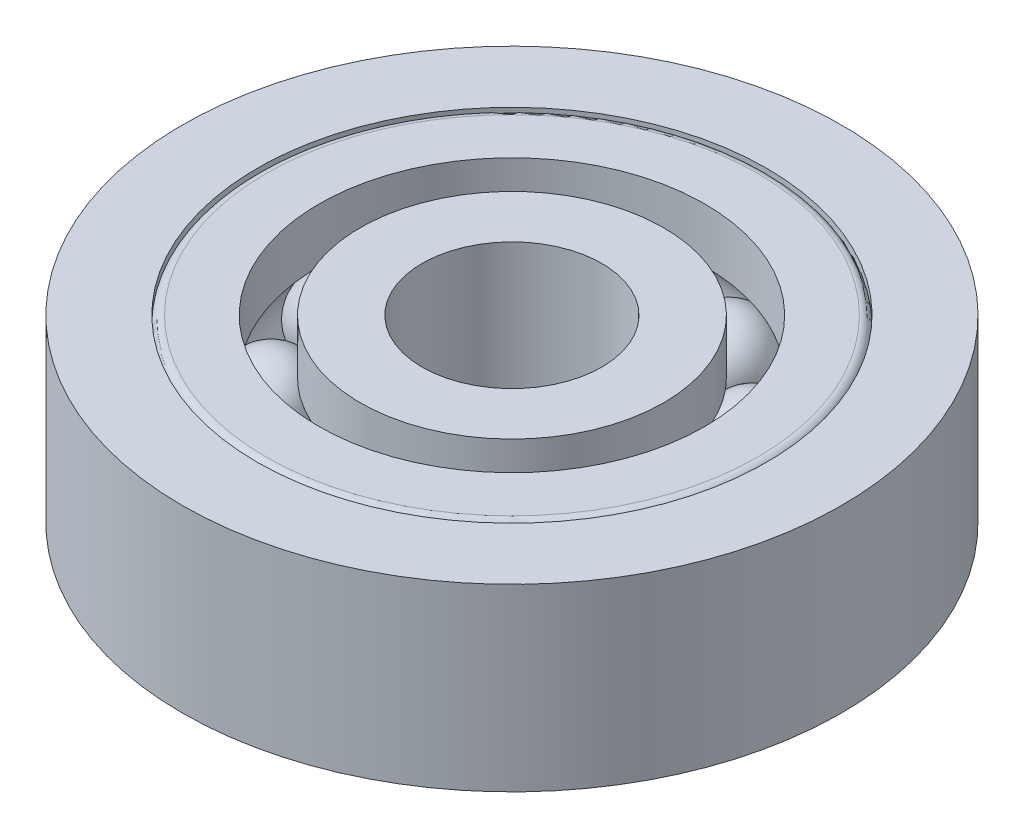
ISO-10303-21;
HEADER;
FILE_DESCRIPTION(('STEP AP214'),'2;1');
FILE_NAME('part.step','',(''),(''),'','','');
FILE_SCHEMA(('AUTOMOTIVE_DESIGN { 1 0 10303 214 1 1 1 1 }'));
ENDSEC;
DATA;
#1=APPLICATION_CONTEXT('core data for automotive mechanical design processes');
#2=APPLICATION_PROTOCOL_DEFINITION('international standard','automotive_design',2000,#1);
#3=PRODUCT_CONTEXT('',#1,'mechanical');
#4=PRODUCT('Part','Part','',(#3));
#5=PRODUCT_RELATED_PRODUCT_CATEGORY('part','',(#4));
#6=PRODUCT_DEFINITION_FORMATION('','',#4);
#7=PRODUCT_DEFINITION_CONTEXT('part definition',#1,'design');
#8=PRODUCT_DEFINITION('design','',#6,#7);
#9=PRODUCT_DEFINITION_SHAPE('','',#8);
#10=(LENGTH_UNIT() NAMED_UNIT(*) SI_UNIT(.MILLI.,.METRE.));
#11=(NAMED_UNIT(*) PLANE_ANGLE_UNIT() SI_UNIT($,.RADIAN.));
#12=(NAMED_UNIT(*) SI_UNIT($,.STERADIAN.) SOLID_ANGLE_UNIT());
#13=UNCERTAINTY_MEASURE_WITH_UNIT(LENGTH_MEASURE(1.E-05),#10,'distance_accuracy_value','');
#14=(GEOMETRIC_REPRESENTATION_CONTEXT(3) GLOBAL_UNCERTAINTY_ASSIGNED_CONTEXT((#13)) GLOBAL_UNIT_ASSIGNED_CONTEXT((#10,
#11,#12)) REPRESENTATION_CONTEXT('',''));
#15=CARTESIAN_POINT('',(0.,0.,0.));
#16=DIRECTION('',(0.,0.,1.));
#17=DIRECTION('',(1.,0.,0.));
#18=AXIS2_PLACEMENT_3D('',#15,#16,#17);
#19=CARTESIAN_POINT('',(-13.9057656321242,5.04553595945562,13.088073298508));
#20=DIRECTION('',(0.,-1.,0.));
#21=DIRECTION('',(-0.809016994374955,0.,0.587785252292462));
#22=AXIS2_PLACEMENT_3D('',#19,#20,#21);
#23=SPHERICAL_SURFACE('',#22,1.37500000000002);
#24=CARTESIAN_POINT('',(-13.9057656321242,3.6705359594556,13.088073298508));
#25=VERTEX_POINT('',#24);
#26=VERTEX_LOOP('',#25);
#27=FACE_BOUND('',#26,.T.);
#28=ADVANCED_FACE('F40',(#27),#23,.T.);
#29=CLOSED_SHELL('',(#28));
#30=MANIFOLD_SOLID_BREP('B2',#29);
#31=CARTESIAN_POINT('',(-11.0307656321242,5.04553595945562,15.1768830665235));
#32=DIRECTION('',(0.,-1.,0.));
#33=DIRECTION('',(-0.309016994374958,0.,0.95105651629515));
#34=AXIS2_PLACEMENT_3D('',#31,#32,#33);
#35=SPHERICAL_SURFACE('',#34,1.37500000000002);
#36=CARTESIAN_POINT('',(-11.0307656321242,3.6705359594556,15.1768830665235));
#37=VERTEX_POINT('',#36);
#38=VERTEX_LOOP('',#37);
#39=FACE_BOUND('',#38,.T.);
#40=ADVANCED_FACE('F59',(#39),#35,.T.);
#41=CLOSED_SHELL('',(#40));
#42=MANIFOLD_SOLID_BREP('B6',#41);
#43=CARTESIAN_POINT('',(-7.47707019681233,5.04553595945562,15.1768830665235));
#44=DIRECTION('',(0.,-1.,0.));
#45=DIRECTION('',(0.309016994374938,0.,0.951056516295157));
#46=AXIS2_PLACEMENT_3D('',#43,#44,#45);
#47=SPHERICAL_SURFACE('',#46,1.37500000000002);
#48=CARTESIAN_POINT('',(-7.47707019681233,3.6705359594556,15.1768830665235));
#49=VERTEX_POINT('',#48);
#50=VERTEX_LOOP('',#49);
#51=FACE_BOUND('',#50,.T.);
#52=ADVANCED_FACE('F78',(#51),#47,.T.);
#53=CLOSED_SHELL('',(#52));
#54=MANIFOLD_SOLID_BREP('B36',#53);
#55=CARTESIAN_POINT('',(-4.6020701968123,5.04553595945562,13.0880732985081));
#56=DIRECTION('',(0.,-1.,0.));
#57=DIRECTION('',(0.809016994374942,0.,0.58778525229248));
#58=AXIS2_PLACEMENT_3D('',#55,#56,#57);
#59=SPHERICAL_SURFACE('',#58,1.37500000000002);
#60=CARTESIAN_POINT('',(-4.6020701968123,3.6705359594556,13.0880732985081));
#61=VERTEX_POINT('',#60);
#62=VERTEX_LOOP('',#61);
#63=FACE_BOUND('',#62,.T.);
#64=ADVANCED_FACE('F97',(#63),#59,.T.);
#65=CLOSED_SHELL('',(#64));
#66=MANIFOLD_SOLID_BREP('B55',#65);
#67=CARTESIAN_POINT('',(-3.50391791446822,5.04553595945562,9.70830809782638));
#68=DIRECTION('',(0.,-1.,0.));
#69=DIRECTION('',(1.,0.,0.));
#70=AXIS2_PLACEMENT_3D('',#67,#68,#69);
#71=SPHERICAL_SURFACE('',#70,1.37500000000002);
#72=CARTESIAN_POINT('',(-3.50391791446822,3.6705359594556,9.70830809782638));
#73=VERTEX_POINT('',#72);
#74=VERTEX_LOOP('',#73);
#75=FACE_BOUND('',#74,.T.);
#76=ADVANCED_FACE('F116',(#75),#71,.T.);
#77=CLOSED_SHELL('',(#76));
#78=MANIFOLD_SOLID_BREP('B74',#77);
#79=CARTESIAN_POINT('',(-4.60207019681226,5.04553595945562,6.32854289714469));
#80=DIRECTION('',(0.,-1.,0.));
#81=DIRECTION('',(0.809016994374951,0.,-0.587785252292469));
#82=AXIS2_PLACEMENT_3D('',#79,#80,#81);
#83=SPHERICAL_SURFACE('',#82,1.37500000000002);
#84=CARTESIAN_POINT('',(-4.60207019681226,3.6705359594556,6.32854289714469));
#85=VERTEX_POINT('',#84);
#86=VERTEX_LOOP('',#85);
#87=FACE_BOUND('',#86,.T.);
#88=ADVANCED_FACE('F135',(#87),#83,.T.);
#89=CLOSED_SHELL('',(#88));
#90=MANIFOLD_SOLID_BREP('B93',#89);
#91=CARTESIAN_POINT('',(-7.47707019681225,5.04553595945562,4.23973312912926));
#92=DIRECTION('',(0.,-1.,0.));
#93=DIRECTION('',(0.309016994374952,0.,-0.951056516295152));
#94=AXIS2_PLACEMENT_3D('',#91,#92,#93);
#95=SPHERICAL_SURFACE('',#94,1.37500000000002);
#96=CARTESIAN_POINT('',(-7.47707019681225,3.6705359594556,4.23973312912926));
#97=VERTEX_POINT('',#96);
#98=VERTEX_LOOP('',#97);
#99=FACE_BOUND('',#98,.T.);
#100=ADVANCED_FACE('F154',(#99),#95,.T.);
#101=CLOSED_SHELL('',(#100));
#102=MANIFOLD_SOLID_BREP('B112',#101);
#103=CARTESIAN_POINT('',(-11.0307656321242,5.04553595945562,4.23973312912924));
#104=DIRECTION('',(0.,-1.,0.));
#105=DIRECTION('',(-0.309016994374945,0.,-0.951056516295155));
#106=AXIS2_PLACEMENT_3D('',#103,#104,#105);
#107=SPHERICAL_SURFACE('',#106,1.37500000000002);
#108=CARTESIAN_POINT('',(-11.0307656321242,3.6705359594556,4.23973312912924));
#109=VERTEX_POINT('',#108);
#110=VERTEX_LOOP('',#109);
#111=FACE_BOUND('',#110,.T.);
#112=ADVANCED_FACE('F173',(#111),#107,.T.);
#113=CLOSED_SHELL('',(#112));
#114=MANIFOLD_SOLID_BREP('B131',#113);
#115=CARTESIAN_POINT('',(-13.9057656321242,5.04553595945562,6.32854289714466));
#116=DIRECTION('',(0.,-1.,0.));
#117=DIRECTION('',(-0.809016994374947,0.,-0.587785252292474));
#118=AXIS2_PLACEMENT_3D('',#115,#116,#117);
#119=SPHERICAL_SURFACE('',#118,1.37500000000002);
#120=CARTESIAN_POINT('',(-13.9057656321242,3.6705359594556,6.32854289714466));
#121=VERTEX_POINT('',#120);
#122=VERTEX_LOOP('',#121);
#123=FACE_BOUND('',#122,.T.);
#124=ADVANCED_FACE('F192',(#123),#119,.T.);
#125=CLOSED_SHELL('',(#124));
#126=MANIFOLD_SOLID_BREP('B150',#125);
#127=CARTESIAN_POINT('',(-15.0039179144682,5.04553595945562,9.70830809782638));
#128=DIRECTION('',(0.,-1.,0.));
#129=DIRECTION('',(-1.,0.,0.));
#130=AXIS2_PLACEMENT_3D('',#127,#128,#129);
#131=SPHERICAL_SURFACE('',#130,1.37500000000002);
#132=CARTESIAN_POINT('',(-15.0039179144682,3.6705359594556,9.70830809782638));
#133=VERTEX_POINT('',#132);
#134=VERTEX_LOOP('',#133);
#135=FACE_BOUND('',#134,.T.);
#136=ADVANCED_FACE('F213',(#135),#131,.T.);
#137=CLOSED_SHELL('',(#136));
#138=MANIFOLD_SOLID_BREP('B169',#137);
#139=CARTESIAN_POINT('',(-9.25391791446822,8.04553595945564,9.70830809782638));
#140=DIRECTION('',(0.,1.,0.));
#141=DIRECTION('',(0.,0.,1.));
#142=AXIS2_PLACEMENT_3D('',#139,#140,#141);
#143=PLANE('',#142);
#144=CARTESIAN_POINT('',(-9.25391791446822,8.04553595945564,9.70830809782638));
#145=DIRECTION('',(0.,1.,0.));
#146=DIRECTION('',(0.,0.,1.));
#147=AXIS2_PLACEMENT_3D('',#144,#145,#146);
#148=CIRCLE('',#147,3.);
#149=CARTESIAN_POINT('',(-9.25391791446822,8.04553595945564,12.7083080978264));
#150=VERTEX_POINT('',#149);
#151=EDGE_CURVE('E212',#150,#150,#148,.T.);
#152=ORIENTED_EDGE('',*,*,#151,.F.);
#153=EDGE_LOOP('',(#152));
#154=FACE_BOUND('',#153,.T.);
#155=CARTESIAN_POINT('',(-9.25391791446823,8.04553595945553,9.70830809782638));
#156=DIRECTION('',(0.,-1.,0.));
#157=DIRECTION('',(1.,0.,0.));
#158=AXIS2_PLACEMENT_3D('',#155,#156,#157);
#159=CIRCLE('',#158,5.06249999999999);
#160=CARTESIAN_POINT('',(-4.19141791446824,8.04553595945555,9.70830809782638));
#161=VERTEX_POINT('',#160);
#162=EDGE_CURVE('E254',#161,#161,#159,.T.);
#163=ORIENTED_EDGE('',*,*,#162,.F.);
#164=EDGE_LOOP('',(#163));
#165=FACE_BOUND('',#164,.T.);
#166=ADVANCED_FACE('F233',(#154,#165),#143,.T.);
#167=CARTESIAN_POINT('',(-9.25391791446822,8.04553595945564,9.70830809782638));
#168=DIRECTION('',(0.,-1.,0.));
#169=DIRECTION('',(0.,0.,-1.));
#170=AXIS2_PLACEMENT_3D('',#167,#168,#169);
#171=CYLINDRICAL_SURFACE('',#170,3.);
#172=ORIENTED_EDGE('',*,*,#151,.T.);
#173=EDGE_LOOP('',(#172));
#174=FACE_BOUND('',#173,.T.);
#175=CARTESIAN_POINT('',(-9.25391791446822,2.04553595945564,9.70830809782638));
#176=DIRECTION('',(0.,1.,0.));
#177=DIRECTION('',(0.,0.,1.));
#178=AXIS2_PLACEMENT_3D('',#175,#176,#177);
#179=CIRCLE('',#178,3.);
#180=CARTESIAN_POINT('',(-9.25391791446822,2.04553595945564,12.7083080978264));
#181=VERTEX_POINT('',#180);
#182=EDGE_CURVE('E237',#181,#181,#179,.T.);
#183=ORIENTED_EDGE('',*,*,#182,.F.);
#184=EDGE_LOOP('',(#183));
#185=FACE_BOUND('',#184,.T.);
#186=ADVANCED_FACE('F262',(#174,#185),#171,.F.);
#187=CARTESIAN_POINT('',(-9.25391791446822,2.04553595945564,9.70830809782638));
#188=DIRECTION('',(0.,1.,0.));
#189=DIRECTION('',(0.,0.,1.));
#190=AXIS2_PLACEMENT_3D('',#187,#188,#189);
#191=PLANE('',#190);
#192=ORIENTED_EDGE('',*,*,#182,.T.);
#193=EDGE_LOOP('',(#192));
#194=FACE_BOUND('',#193,.T.);
#195=CARTESIAN_POINT('',(-9.25391791446821,2.04553595945564,9.70830809782638));
#196=DIRECTION('',(0.,-1.,0.));
#197=DIRECTION('',(1.,0.,0.));
#198=AXIS2_PLACEMENT_3D('',#195,#196,#197);
#199=CIRCLE('',#198,5.06250000000001);
#200=CARTESIAN_POINT('',(-4.1914179144682,2.04553595945566,9.70830809782638));
#201=VERTEX_POINT('',#200);
#202=EDGE_CURVE('E244',#201,#201,#199,.T.);
#203=ORIENTED_EDGE('',*,*,#202,.T.);
#204=EDGE_LOOP('',(#203));
#205=FACE_BOUND('',#204,.T.);
#206=ADVANCED_FACE('F235',(#194,#205),#191,.F.);
#207=CARTESIAN_POINT('',(-9.25391791446473,-994.954464040544,9.70830809782638));
#208=DIRECTION('',(0.,-1.,0.));
#209=DIRECTION('',(1.,0.,0.));
#210=AXIS2_PLACEMENT_3D('',#207,#208,#209);
#211=CYLINDRICAL_SURFACE('',#210,5.0625);
#212=ORIENTED_EDGE('',*,*,#162,.T.);
#213=EDGE_LOOP('',(#212));
#214=FACE_BOUND('',#213,.T.);
#215=CARTESIAN_POINT('',(-9.25391791446823,6.23632088965917,9.70830809782638));
#216=DIRECTION('',(0.,-1.,0.));
#217=DIRECTION('',(1.,0.,0.));
#218=AXIS2_PLACEMENT_3D('',#215,#216,#217);
#219=CIRCLE('',#218,5.0625);
#220=CARTESIAN_POINT('',(-4.19141791446823,6.23632088965919,9.70830809782638));
#221=VERTEX_POINT('',#220);
#222=EDGE_CURVE('E251',#221,#221,#219,.T.);
#223=ORIENTED_EDGE('',*,*,#222,.F.);
#224=EDGE_LOOP('',(#223));
#225=FACE_BOUND('',#224,.T.);
#226=ADVANCED_FACE('F258',(#214,#225),#211,.T.);
#227=CARTESIAN_POINT('',(-9.25391791446822,5.04553595945564,9.70830809782638));
#228=DIRECTION('',(0.,-1.,0.));
#229=DIRECTION('',(1.,0.,0.));
#230=AXIS2_PLACEMENT_3D('',#227,#228,#229);
#231=TOROIDAL_SURFACE('',#230,5.75,1.375);
#232=ORIENTED_EDGE('',*,*,#222,.T.);
#233=EDGE_LOOP('',(#232));
#234=FACE_BOUND('',#233,.T.);
#235=CARTESIAN_POINT('',(-9.25391791446822,3.85475102925201,9.70830809782638));
#236=DIRECTION('',(0.,-1.,0.));
#237=DIRECTION('',(1.,0.,0.));
#238=AXIS2_PLACEMENT_3D('',#235,#236,#237);
#239=CIRCLE('',#238,5.06250000000001);
#240=CARTESIAN_POINT('',(-4.19141791446821,3.85475102925203,9.70830809782638));
#241=VERTEX_POINT('',#240);
#242=EDGE_CURVE('E248',#241,#241,#239,.T.);
#243=ORIENTED_EDGE('',*,*,#242,.F.);
#244=EDGE_LOOP('',(#243));
#245=FACE_BOUND('',#244,.T.);
#246=ADVANCED_FACE('F272',(#234,#245),#231,.F.);
#247=CARTESIAN_POINT('',(-9.25391791446473,-994.954464040544,9.70830809782638));
#248=DIRECTION('',(0.,-1.,0.));
#249=DIRECTION('',(1.,0.,0.));
#250=AXIS2_PLACEMENT_3D('',#247,#248,#249);
#251=CYLINDRICAL_SURFACE('',#250,5.06250000000001);
#252=ORIENTED_EDGE('',*,*,#202,.F.);
#253=EDGE_LOOP('',(#252));
#254=FACE_BOUND('',#253,.T.);
#255=ORIENTED_EDGE('',*,*,#242,.T.);
#256=EDGE_LOOP('',(#255));
#257=FACE_BOUND('',#256,.T.);
#258=ADVANCED_FACE('F269',(#254,#257),#251,.T.);
#259=CLOSED_SHELL('',(#166,#186,#206,#226,#246,#258));
#260=MANIFOLD_SOLID_BREP('B188',#259);
#261=CARTESIAN_POINT('',(-9.25391791446822,8.04553595945564,9.70830809782638));
#262=DIRECTION('',(0.,1.,0.));
#263=DIRECTION('',(0.,0.,1.));
#264=AXIS2_PLACEMENT_3D('',#261,#262,#263);
#265=PLANE('',#264);
#266=CARTESIAN_POINT('',(-9.25391791446823,8.04553595945553,9.70830809782638));
#267=DIRECTION('',(0.,-1.,0.));
#268=DIRECTION('',(1.,0.,0.));
#269=AXIS2_PLACEMENT_3D('',#266,#267,#268);
#270=CIRCLE('',#269,6.43749999999999);
#271=CARTESIAN_POINT('',(-2.81641791446825,8.04553595945556,9.70830809782638));
#272=VERTEX_POINT('',#271);
#273=EDGE_CURVE('E329',#272,#272,#270,.T.);
#274=ORIENTED_EDGE('',*,*,#273,.T.);
#275=EDGE_LOOP('',(#274));
#276=FACE_BOUND('',#275,.T.);
#277=CARTESIAN_POINT('',(-9.25391791446822,8.04553595945564,9.70830809782638));
#278=DIRECTION('',(0.,1.,0.));
#279=DIRECTION('',(0.,0.,1.));
#280=AXIS2_PLACEMENT_3D('',#277,#278,#279);
#281=CIRCLE('',#280,8.2);
#282=CARTESIAN_POINT('',(-9.25391791446822,8.04553595945564,17.9083080978264));
#283=VERTEX_POINT('',#282);
#284=EDGE_CURVE('E351',#283,#283,#281,.T.);
#285=ORIENTED_EDGE('',*,*,#284,.T.);
#286=EDGE_LOOP('',(#285));
#287=FACE_BOUND('',#286,.T.);
#288=ADVANCED_FACE('F325',(#276,#287),#265,.T.);
#289=CARTESIAN_POINT('',(-9.25391791446822,2.04553595945564,9.70830809782638));
#290=DIRECTION('',(0.,1.,0.));
#291=DIRECTION('',(0.,0.,1.));
#292=AXIS2_PLACEMENT_3D('',#289,#290,#291);
#293=PLANE('',#292);
#294=CARTESIAN_POINT('',(-9.25391791446821,2.04553595945564,9.70830809782638));
#295=DIRECTION('',(0.,-1.,0.));
#296=DIRECTION('',(1.,0.,0.));
#297=AXIS2_PLACEMENT_3D('',#294,#295,#296);
#298=CIRCLE('',#297,6.43750000000001);
#299=CARTESIAN_POINT('',(-2.8164179144682,2.04553595945566,9.70830809782638));
#300=VERTEX_POINT('',#299);
#301=EDGE_CURVE('E232',#300,#300,#298,.T.);
#302=ORIENTED_EDGE('',*,*,#301,.F.);
#303=EDGE_LOOP('',(#302));
#304=FACE_BOUND('',#303,.T.);
#305=CARTESIAN_POINT('',(-9.25391791446822,2.04553595945564,9.70830809782638));
#306=DIRECTION('',(0.,1.,0.));
#307=DIRECTION('',(0.,0.,1.));
#308=AXIS2_PLACEMENT_3D('',#305,#306,#307);
#309=CIRCLE('',#308,8.2);
#310=CARTESIAN_POINT('',(-9.25391791446822,2.04553595945564,17.9083080978264));
#311=VERTEX_POINT('',#310);
#312=EDGE_CURVE('E348',#311,#311,#309,.F.);
#313=ORIENTED_EDGE('',*,*,#312,.T.);
#314=EDGE_LOOP('',(#313));
#315=FACE_BOUND('',#314,.T.);
#316=ADVANCED_FACE('F396',(#304,#315),#293,.F.);
#317=CARTESIAN_POINT('',(-9.25391791446822,2.34553595945564,9.70830809782638));
#318=DIRECTION('',(0.,1.,0.));
#319=DIRECTION('',(0.,0.,1.));
#320=AXIS2_PLACEMENT_3D('',#317,#318,#319);
#321=TOROIDAL_SURFACE('',#320,8.2,0.3);
#322=ORIENTED_EDGE('',*,*,#312,.F.);
#323=EDGE_LOOP('',(#322));
#324=FACE_BOUND('',#323,.T.);
#325=CARTESIAN_POINT('',(-9.25391791446822,2.34553595945564,9.70830809782638));
#326=DIRECTION('',(0.,1.,0.));
#327=DIRECTION('',(0.,0.,1.));
#328=AXIS2_PLACEMENT_3D('',#325,#326,#327);
#329=CIRCLE('',#328,8.5);
#330=CARTESIAN_POINT('',(-9.25391791446822,2.34553595945564,18.2083080978264));
#331=VERTEX_POINT('',#330);
#332=EDGE_CURVE('E345',#331,#331,#329,.T.);
#333=ORIENTED_EDGE('',*,*,#332,.F.);
#334=EDGE_LOOP('',(#333));
#335=FACE_BOUND('',#334,.T.);
#336=ADVANCED_FACE('F400',(#324,#335),#321,.T.);
#337=CARTESIAN_POINT('',(-9.25391791446822,7.74553595945564,9.70830809782638));
#338=DIRECTION('',(0.,1.,0.));
#339=DIRECTION('',(0.,0.,1.));
#340=AXIS2_PLACEMENT_3D('',#337,#338,#339);
#341=TOROIDAL_SURFACE('',#340,8.2,0.3);
#342=CARTESIAN_POINT('',(-9.25391791446822,7.74553595945564,9.70830809782638));
#343=DIRECTION('',(0.,1.,0.));
#344=DIRECTION('',(0.,0.,1.));
#345=AXIS2_PLACEMENT_3D('',#342,#343,#344);
#346=CIRCLE('',#345,8.5);
#347=CARTESIAN_POINT('',(-9.25391791446822,7.74553595945564,18.2083080978264));
#348=VERTEX_POINT('',#347);
#349=EDGE_CURVE('E342',#348,#348,#346,.F.);
#350=ORIENTED_EDGE('',*,*,#349,.F.);
#351=EDGE_LOOP('',(#350));
#352=FACE_BOUND('',#351,.T.);
#353=ORIENTED_EDGE('',*,*,#284,.F.);
#354=EDGE_LOOP('',(#353));
#355=FACE_BOUND('',#354,.T.);
#356=ADVANCED_FACE('F375',(#352,#355),#341,.T.);
#357=CARTESIAN_POINT('',(-9.25391791446473,-994.954464040544,9.70830809782638));
#358=DIRECTION('',(0.,-1.,0.));
#359=DIRECTION('',(1.,0.,0.));
#360=AXIS2_PLACEMENT_3D('',#357,#358,#359);
#361=CYLINDRICAL_SURFACE('',#360,6.43749999999999);
#362=ORIENTED_EDGE('',*,*,#273,.F.);
#363=EDGE_LOOP('',(#362));
#364=FACE_BOUND('',#363,.T.);
#365=CARTESIAN_POINT('',(-9.25391791446823,6.23632088965917,9.70830809782638));
#366=DIRECTION('',(0.,-1.,0.));
#367=DIRECTION('',(1.,0.,0.));
#368=AXIS2_PLACEMENT_3D('',#365,#366,#367);
#369=CIRCLE('',#368,6.43749999999999);
#370=CARTESIAN_POINT('',(-2.81641791446823,6.23632088965919,9.70830809782638));
#371=VERTEX_POINT('',#370);
#372=EDGE_CURVE('E337',#371,#371,#369,.T.);
#373=ORIENTED_EDGE('',*,*,#372,.T.);
#374=EDGE_LOOP('',(#373));
#375=FACE_BOUND('',#374,.T.);
#376=ADVANCED_FACE('F372',(#364,#375),#361,.F.);
#377=CARTESIAN_POINT('',(-9.25391791446822,5.04553595945564,9.70830809782638));
#378=DIRECTION('',(0.,-1.,0.));
#379=DIRECTION('',(1.,0.,0.));
#380=AXIS2_PLACEMENT_3D('',#377,#378,#379);
#381=TOROIDAL_SURFACE('',#380,5.75,1.375);
#382=ORIENTED_EDGE('',*,*,#372,.F.);
#383=EDGE_LOOP('',(#382));
#384=FACE_BOUND('',#383,.T.);
#385=CARTESIAN_POINT('',(-9.25391791446822,3.85475102925201,9.70830809782638));
#386=DIRECTION('',(0.,-1.,0.));
#387=DIRECTION('',(1.,0.,0.));
#388=AXIS2_PLACEMENT_3D('',#385,#386,#387);
#389=CIRCLE('',#388,6.4375);
#390=CARTESIAN_POINT('',(-2.81641791446822,3.85475102925203,9.70830809782638));
#391=VERTEX_POINT('',#390);
#392=EDGE_CURVE('E333',#391,#391,#389,.T.);
#393=ORIENTED_EDGE('',*,*,#392,.T.);
#394=EDGE_LOOP('',(#393));
#395=FACE_BOUND('',#394,.T.);
#396=ADVANCED_FACE('F327',(#384,#395),#381,.F.);
#397=CARTESIAN_POINT('',(-9.25391791446473,-994.954464040544,9.70830809782638));
#398=DIRECTION('',(0.,-1.,0.));
#399=DIRECTION('',(1.,0.,0.));
#400=AXIS2_PLACEMENT_3D('',#397,#398,#399);
#401=CYLINDRICAL_SURFACE('',#400,6.43750000000001);
#402=ORIENTED_EDGE('',*,*,#301,.T.);
#403=EDGE_LOOP('',(#402));
#404=FACE_BOUND('',#403,.T.);
#405=ORIENTED_EDGE('',*,*,#392,.F.);
#406=EDGE_LOOP('',(#405));
#407=FACE_BOUND('',#406,.T.);
#408=ADVANCED_FACE('F381',(#404,#407),#401,.F.);
#409=CARTESIAN_POINT('',(-9.25391791446822,-29.0671624127524,9.70830809782638));
#410=DIRECTION('',(0.,1.,0.));
#411=DIRECTION('',(0.,0.,1.));
#412=AXIS2_PLACEMENT_3D('',#409,#410,#411);
#413=CYLINDRICAL_SURFACE('',#412,8.5);
#414=CARTESIAN_POINT('',(-9.25391791446822,8.04553595945564,9.70830809782638));
#415=DIRECTION('',(0.,1.,0.));
#416=DIRECTION('',(0.,0.,1.));
#417=AXIS2_PLACEMENT_3D('',#414,#415,#416);
#418=CIRCLE('',#417,8.5);
#419=CARTESIAN_POINT('',(-9.25391791446822,8.04553595945564,18.2083080978264));
#420=VERTEX_POINT('',#419);
#421=EDGE_CURVE('E361',#420,#420,#418,.T.);
#422=ORIENTED_EDGE('',*,*,#421,.T.);
#423=EDGE_LOOP('',(#422));
#424=FACE_BOUND('',#423,.T.);
#425=ORIENTED_EDGE('',*,*,#349,.T.);
#426=EDGE_LOOP('',(#425));
#427=FACE_BOUND('',#426,.T.);
#428=ADVANCED_FACE('F385',(#424,#427),#413,.F.);
#429=CARTESIAN_POINT('',(-9.25391791446822,-29.0671624127524,9.70830809782638));
#430=DIRECTION('',(0.,1.,0.));
#431=DIRECTION('',(0.,0.,1.));
#432=AXIS2_PLACEMENT_3D('',#429,#430,#431);
#433=CYLINDRICAL_SURFACE('',#432,11.);
#434=CARTESIAN_POINT('',(-9.25391791446822,2.04553595945564,9.70830809782638));
#435=DIRECTION('',(0.,1.,0.));
#436=DIRECTION('',(0.,0.,1.));
#437=AXIS2_PLACEMENT_3D('',#434,#435,#436);
#438=CIRCLE('',#437,11.);
#439=CARTESIAN_POINT('',(-9.25391791446822,2.04553595945564,20.7083080978264));
#440=VERTEX_POINT('',#439);
#441=EDGE_CURVE('E357',#440,#440,#438,.F.);
#442=ORIENTED_EDGE('',*,*,#441,.F.);
#443=EDGE_LOOP('',(#442));
#444=FACE_BOUND('',#443,.T.);
#445=CARTESIAN_POINT('',(-9.25391791446822,8.04553595945564,9.70830809782638));
#446=DIRECTION('',(0.,1.,0.));
#447=DIRECTION('',(0.,0.,1.));
#448=AXIS2_PLACEMENT_3D('',#445,#446,#447);
#449=CIRCLE('',#448,11.);
#450=CARTESIAN_POINT('',(-9.25391791446822,8.04553595945564,20.7083080978264));
#451=VERTEX_POINT('',#450);
#452=EDGE_CURVE('E358',#451,#451,#449,.T.);
#453=ORIENTED_EDGE('',*,*,#452,.F.);
#454=EDGE_LOOP('',(#453));
#455=FACE_BOUND('',#454,.T.);
#456=ADVANCED_FACE('F390',(#444,#455),#433,.T.);
#457=CARTESIAN_POINT('',(-9.25391791446822,8.04553595945564,9.70830809782638));
#458=DIRECTION('',(0.,1.,0.));
#459=DIRECTION('',(0.,0.,1.));
#460=AXIS2_PLACEMENT_3D('',#457,#458,#459);
#461=PLANE('',#460);
#462=ORIENTED_EDGE('',*,*,#421,.F.);
#463=EDGE_LOOP('',(#462));
#464=FACE_BOUND('',#463,.T.);
#465=ORIENTED_EDGE('',*,*,#452,.T.);
#466=EDGE_LOOP('',(#465));
#467=FACE_BOUND('',#466,.T.);
#468=ADVANCED_FACE('F415',(#464,#467),#461,.T.);
#469=ORIENTED_EDGE('',*,*,#332,.T.);
#470=EDGE_LOOP('',(#469));
#471=FACE_BOUND('',#470,.T.);
#472=CARTESIAN_POINT('',(-9.25391791446822,2.04553595945564,9.70830809782638));
#473=DIRECTION('',(0.,1.,0.));
#474=DIRECTION('',(0.,0.,1.));
#475=AXIS2_PLACEMENT_3D('',#472,#473,#474);
#476=CIRCLE('',#475,8.5);
#477=CARTESIAN_POINT('',(-9.25391791446822,2.04553595945564,18.2083080978264));
#478=VERTEX_POINT('',#477);
#479=EDGE_CURVE('E354',#478,#478,#476,.F.);
#480=ORIENTED_EDGE('',*,*,#479,.T.);
#481=EDGE_LOOP('',(#480));
#482=FACE_BOUND('',#481,.T.);
#483=ADVANCED_FACE('F393',(#471,#482),#413,.F.);
#484=CARTESIAN_POINT('',(-9.25391791446822,2.04553595945564,9.70830809782638));
#485=DIRECTION('',(0.,1.,0.));
#486=DIRECTION('',(0.,0.,1.));
#487=AXIS2_PLACEMENT_3D('',#484,#485,#486);
#488=PLANE('',#487);
#489=ORIENTED_EDGE('',*,*,#441,.T.);
#490=EDGE_LOOP('',(#489));
#491=FACE_BOUND('',#490,.T.);
#492=ORIENTED_EDGE('',*,*,#479,.F.);
#493=EDGE_LOOP('',(#492));
#494=FACE_BOUND('',#493,.T.);
#495=ADVANCED_FACE('F414',(#491,#494),#488,.F.);
#496=CLOSED_SHELL('',(#288,#316,#336,#356,#376,#396,#408,#428,#456,#468,#483,#495));
#497=MANIFOLD_SOLID_BREP('B207',#496);
#498=ADVANCED_BREP_SHAPE_REPRESENTATION('',(#18,#30,#42,#54,#66,#78,#90,#102,#114,#126,#138,
#260,#497),#14);
#499=SHAPE_DEFINITION_REPRESENTATION(#9,#498);
ENDSEC;
END-ISO-10303-21;
